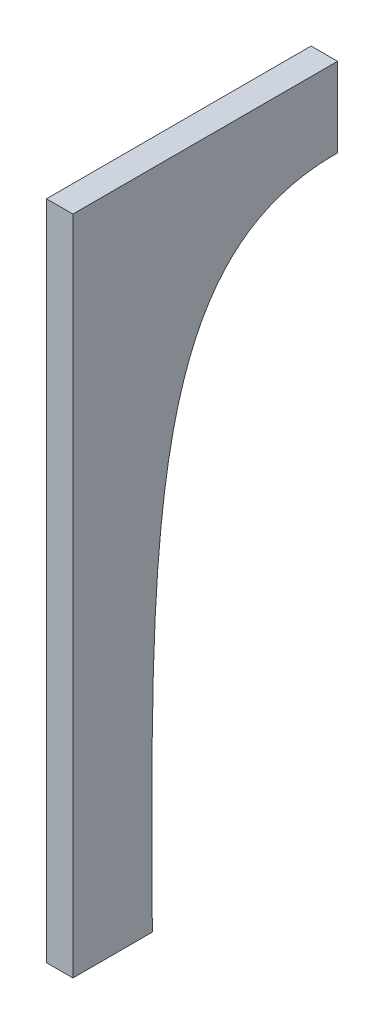
ISO-10303-21;
HEADER;
FILE_DESCRIPTION(('STEP AP214'),'2;1');
FILE_NAME('part.step','',(''),(''),'','','');
FILE_SCHEMA(('AUTOMOTIVE_DESIGN { 1 0 10303 214 1 1 1 1 }'));
ENDSEC;
DATA;
#1=APPLICATION_CONTEXT('core data for automotive mechanical design processes');
#2=APPLICATION_PROTOCOL_DEFINITION('international standard','automotive_design',2000,#1);
#3=PRODUCT_CONTEXT('',#1,'mechanical');
#4=PRODUCT('Part','Part','',(#3));
#5=PRODUCT_RELATED_PRODUCT_CATEGORY('part','',(#4));
#6=PRODUCT_DEFINITION_FORMATION('','',#4);
#7=PRODUCT_DEFINITION_CONTEXT('part definition',#1,'design');
#8=PRODUCT_DEFINITION('design','',#6,#7);
#9=PRODUCT_DEFINITION_SHAPE('','',#8);
#10=(LENGTH_UNIT() NAMED_UNIT(*) SI_UNIT(.MILLI.,.METRE.));
#11=(NAMED_UNIT(*) PLANE_ANGLE_UNIT() SI_UNIT($,.RADIAN.));
#12=(NAMED_UNIT(*) SI_UNIT($,.STERADIAN.) SOLID_ANGLE_UNIT());
#13=UNCERTAINTY_MEASURE_WITH_UNIT(LENGTH_MEASURE(1.E-05),#10,'distance_accuracy_value','');
#14=(GEOMETRIC_REPRESENTATION_CONTEXT(3) GLOBAL_UNCERTAINTY_ASSIGNED_CONTEXT((#13)) GLOBAL_UNIT_ASSIGNED_CONTEXT((#10,
#11,#12)) REPRESENTATION_CONTEXT('',''));
#15=CARTESIAN_POINT('',(0.,0.,0.));
#16=DIRECTION('',(0.,0.,1.));
#17=DIRECTION('',(1.,0.,0.));
#18=AXIS2_PLACEMENT_3D('',#15,#16,#17);
#19=CARTESIAN_POINT('',(12.7,0.,0.));
#20=DIRECTION('',(0.,1.,0.));
#21=DIRECTION('',(0.,0.,1.));
#22=AXIS2_PLACEMENT_3D('',#19,#20,#21);
#23=PLANE('',#22);
#24=DIRECTION('',(0.,0.,-1.));
#25=VECTOR('',#24,1.);
#26=CARTESIAN_POINT('',(0.,0.,0.));
#27=LINE('',#26,#25);
#28=CARTESIAN_POINT('',(0.,0.,0.));
#29=VERTEX_POINT('',#28);
#30=CARTESIAN_POINT('',(0.,0.,-38.1));
#31=VERTEX_POINT('',#30);
#32=EDGE_CURVE('E110',#29,#31,#27,.T.);
#33=ORIENTED_EDGE('',*,*,#32,.T.);
#34=DIRECTION('',(-1.,0.,0.));
#35=VECTOR('',#34,1.);
#36=CARTESIAN_POINT('',(12.7,0.,-38.1));
#37=LINE('',#36,#35);
#38=CARTESIAN_POINT('',(12.7,0.,-38.1));
#39=VERTEX_POINT('',#38);
#40=EDGE_CURVE('E11',#39,#31,#37,.T.);
#41=ORIENTED_EDGE('',*,*,#40,.F.);
#42=DIRECTION('',(0.,0.,-1.));
#43=VECTOR('',#42,1.);
#44=CARTESIAN_POINT('',(12.7,0.,0.));
#45=LINE('',#44,#43);
#46=CARTESIAN_POINT('',(12.7,0.,0.));
#47=VERTEX_POINT('',#46);
#48=EDGE_CURVE('E123',#47,#39,#45,.T.);
#49=ORIENTED_EDGE('',*,*,#48,.F.);
#50=DIRECTION('',(-1.,0.,0.));
#51=VECTOR('',#50,1.);
#52=CARTESIAN_POINT('',(12.7,0.,0.));
#53=LINE('',#52,#51);
#54=EDGE_CURVE('E106',#47,#29,#53,.T.);
#55=ORIENTED_EDGE('',*,*,#54,.T.);
#56=EDGE_LOOP('',(#33,#41,#49,#55));
#57=FACE_BOUND('',#56,.T.);
#58=ADVANCED_FACE('F36',(#57),#23,.F.);
#59=CARTESIAN_POINT('',(12.7,0.,-38.1));
#60=CARTESIAN_POINT('',(12.7,172.867425698746,-36.9394098631019));
#61=CARTESIAN_POINT('',(12.7,280.238281825212,-37.3011919116513));
#62=CARTESIAN_POINT('',(12.7,279.4,-127.));
#63=B_SPLINE_CURVE_WITH_KNOTS('',3,(#59,#60,#61,#62),.UNSPECIFIED.,.F.,.F.,(4,4),(0.,1.),.UNSPECIFIED.);
#64=DIRECTION('',(-1.,0.,0.));
#65=VECTOR('',#64,1.);
#66=SURFACE_OF_LINEAR_EXTRUSION('',#63,#65);
#67=CARTESIAN_POINT('',(0.,0.,-38.1));
#68=CARTESIAN_POINT('',(0.,172.867425698746,-36.9394098631019));
#69=CARTESIAN_POINT('',(0.,280.238281825212,-37.3011919116513));
#70=CARTESIAN_POINT('',(0.,279.4,-127.));
#71=B_SPLINE_CURVE_WITH_KNOTS('',3,(#67,#68,#69,#70),.UNSPECIFIED.,.F.,.F.,(4,4),(0.,1.),.UNSPECIFIED.);
#72=CARTESIAN_POINT('',(0.,279.4,-127.));
#73=VERTEX_POINT('',#72);
#74=EDGE_CURVE('E113',#31,#73,#71,.T.);
#75=ORIENTED_EDGE('',*,*,#74,.T.);
#76=DIRECTION('',(-1.,0.,0.));
#77=VECTOR('',#76,1.);
#78=CARTESIAN_POINT('',(12.7,279.4,-127.));
#79=LINE('',#78,#77);
#80=CARTESIAN_POINT('',(12.7,279.4,-127.));
#81=VERTEX_POINT('',#80);
#82=EDGE_CURVE('E44',#81,#73,#79,.T.);
#83=ORIENTED_EDGE('',*,*,#82,.F.);
#84=EDGE_CURVE('E86',#39,#81,#63,.T.);
#85=ORIENTED_EDGE('',*,*,#84,.F.);
#86=ORIENTED_EDGE('',*,*,#40,.T.);
#87=EDGE_LOOP('',(#75,#83,#85,#86));
#88=FACE_BOUND('',#87,.T.);
#89=ADVANCED_FACE('F142',(#88),#66,.F.);
#90=CARTESIAN_POINT('',(12.7,317.5,-127.));
#91=DIRECTION('',(0.,0.,1.));
#92=DIRECTION('',(1.,0.,0.));
#93=AXIS2_PLACEMENT_3D('',#90,#91,#92);
#94=PLANE('',#93);
#95=DIRECTION('',(0.,1.,0.));
#96=VECTOR('',#95,1.);
#97=CARTESIAN_POINT('',(0.,317.5,-127.));
#98=LINE('',#97,#96);
#99=CARTESIAN_POINT('',(0.,317.5,-127.));
#100=VERTEX_POINT('',#99);
#101=EDGE_CURVE('E101',#73,#100,#98,.T.);
#102=ORIENTED_EDGE('',*,*,#101,.T.);
#103=DIRECTION('',(-1.,0.,0.));
#104=VECTOR('',#103,1.);
#105=CARTESIAN_POINT('',(12.7,317.5,-127.));
#106=LINE('',#105,#104);
#107=CARTESIAN_POINT('',(12.7,317.5,-127.));
#108=VERTEX_POINT('',#107);
#109=EDGE_CURVE('E98',#108,#100,#106,.T.);
#110=ORIENTED_EDGE('',*,*,#109,.F.);
#111=DIRECTION('',(0.,1.,0.));
#112=VECTOR('',#111,1.);
#113=CARTESIAN_POINT('',(12.7,317.5,-127.));
#114=LINE('',#113,#112);
#115=EDGE_CURVE('E90',#81,#108,#114,.T.);
#116=ORIENTED_EDGE('',*,*,#115,.F.);
#117=ORIENTED_EDGE('',*,*,#82,.T.);
#118=EDGE_LOOP('',(#102,#110,#116,#117));
#119=FACE_BOUND('',#118,.T.);
#120=ADVANCED_FACE('F99',(#119),#94,.F.);
#121=CARTESIAN_POINT('',(12.7,317.5,0.));
#122=DIRECTION('',(0.,-1.,0.));
#123=DIRECTION('',(0.,0.,-1.));
#124=AXIS2_PLACEMENT_3D('',#121,#122,#123);
#125=PLANE('',#124);
#126=DIRECTION('',(0.,0.,1.));
#127=VECTOR('',#126,1.);
#128=CARTESIAN_POINT('',(0.,317.5,0.));
#129=LINE('',#128,#127);
#130=CARTESIAN_POINT('',(0.,317.5,0.));
#131=VERTEX_POINT('',#130);
#132=EDGE_CURVE('E72',#100,#131,#129,.T.);
#133=ORIENTED_EDGE('',*,*,#132,.T.);
#134=DIRECTION('',(-1.,0.,0.));
#135=VECTOR('',#134,1.);
#136=CARTESIAN_POINT('',(12.7,317.5,0.));
#137=LINE('',#136,#135);
#138=CARTESIAN_POINT('',(12.7,317.5,0.));
#139=VERTEX_POINT('',#138);
#140=EDGE_CURVE('E102',#139,#131,#137,.T.);
#141=ORIENTED_EDGE('',*,*,#140,.F.);
#142=DIRECTION('',(0.,0.,1.));
#143=VECTOR('',#142,1.);
#144=CARTESIAN_POINT('',(12.7,317.5,0.));
#145=LINE('',#144,#143);
#146=EDGE_CURVE('E94',#108,#139,#145,.T.);
#147=ORIENTED_EDGE('',*,*,#146,.F.);
#148=ORIENTED_EDGE('',*,*,#109,.T.);
#149=EDGE_LOOP('',(#133,#141,#147,#148));
#150=FACE_BOUND('',#149,.T.);
#151=ADVANCED_FACE('F104',(#150),#125,.F.);
#152=CARTESIAN_POINT('',(12.7,0.,0.));
#153=DIRECTION('',(0.,0.,-1.));
#154=DIRECTION('',(-1.,0.,0.));
#155=AXIS2_PLACEMENT_3D('',#152,#153,#154);
#156=PLANE('',#155);
#157=DIRECTION('',(0.,-1.,0.));
#158=VECTOR('',#157,1.);
#159=CARTESIAN_POINT('',(0.,0.,0.));
#160=LINE('',#159,#158);
#161=EDGE_CURVE('E78',#131,#29,#160,.T.);
#162=ORIENTED_EDGE('',*,*,#161,.T.);
#163=ORIENTED_EDGE('',*,*,#54,.F.);
#164=DIRECTION('',(0.,-1.,0.));
#165=VECTOR('',#164,1.);
#166=CARTESIAN_POINT('',(12.7,0.,0.));
#167=LINE('',#166,#165);
#168=EDGE_CURVE('E52',#139,#47,#167,.T.);
#169=ORIENTED_EDGE('',*,*,#168,.F.);
#170=ORIENTED_EDGE('',*,*,#140,.T.);
#171=EDGE_LOOP('',(#162,#163,#169,#170));
#172=FACE_BOUND('',#171,.T.);
#173=ADVANCED_FACE('F131',(#172),#156,.F.);
#174=CARTESIAN_POINT('',(12.7,204.839640321485,-48.4777256655324));
#175=DIRECTION('',(1.,0.,0.));
#176=DIRECTION('',(0.,0.,-1.));
#177=AXIS2_PLACEMENT_3D('',#174,#175,#176);
#178=PLANE('',#177);
#179=ORIENTED_EDGE('',*,*,#48,.T.);
#180=ORIENTED_EDGE('',*,*,#84,.T.);
#181=ORIENTED_EDGE('',*,*,#115,.T.);
#182=ORIENTED_EDGE('',*,*,#146,.T.);
#183=ORIENTED_EDGE('',*,*,#168,.T.);
#184=EDGE_LOOP('',(#179,#180,#181,#182,#183));
#185=FACE_BOUND('',#184,.T.);
#186=ADVANCED_FACE('F92',(#185),#178,.T.);
#187=CARTESIAN_POINT('',(0.,204.839640321485,-48.4777256655324));
#188=DIRECTION('',(1.,0.,0.));
#189=DIRECTION('',(0.,0.,-1.));
#190=AXIS2_PLACEMENT_3D('',#187,#188,#189);
#191=PLANE('',#190);
#192=ORIENTED_EDGE('',*,*,#32,.F.);
#193=ORIENTED_EDGE('',*,*,#161,.F.);
#194=ORIENTED_EDGE('',*,*,#132,.F.);
#195=ORIENTED_EDGE('',*,*,#101,.F.);
#196=ORIENTED_EDGE('',*,*,#74,.F.);
#197=EDGE_LOOP('',(#192,#193,#194,#195,#196));
#198=FACE_BOUND('',#197,.T.);
#199=ADVANCED_FACE('F127',(#198),#191,.F.);
#200=CLOSED_SHELL('',(#58,#89,#120,#151,#173,#186,#199));
#201=MANIFOLD_SOLID_BREP('B2',#200);
#202=ADVANCED_BREP_SHAPE_REPRESENTATION('',(#18,#201),#14);
#203=SHAPE_DEFINITION_REPRESENTATION(#9,#202);
ENDSEC;
END-ISO-10303-21;
